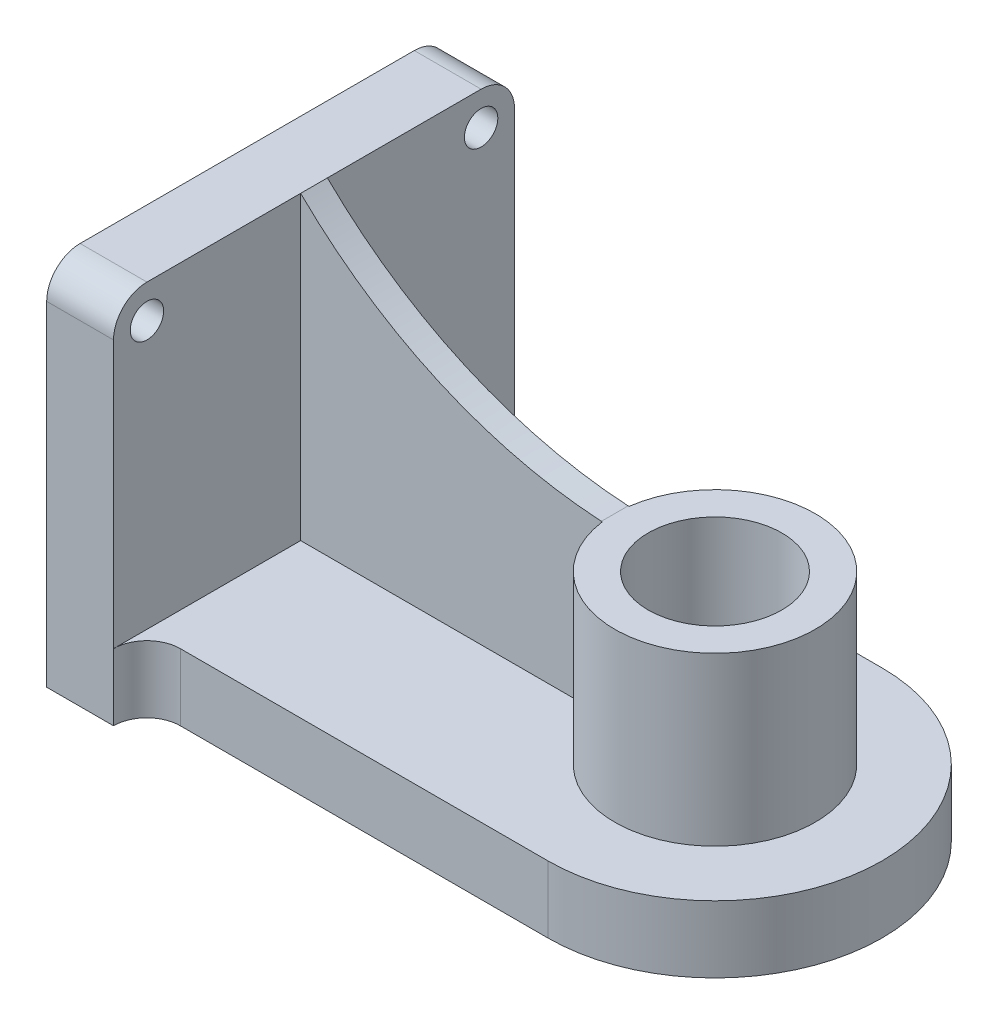
ISO-10303-21;
HEADER;
FILE_DESCRIPTION(('STEP AP214'),'2;1');
FILE_NAME('part.step','',(''),(''),'','','');
FILE_SCHEMA(('AUTOMOTIVE_DESIGN { 1 0 10303 214 1 1 1 1 }'));
ENDSEC;
DATA;
#1=APPLICATION_CONTEXT('core data for automotive mechanical design processes');
#2=APPLICATION_PROTOCOL_DEFINITION('international standard','automotive_design',2000,#1);
#3=PRODUCT_CONTEXT('',#1,'mechanical');
#4=PRODUCT('Part','Part','',(#3));
#5=PRODUCT_RELATED_PRODUCT_CATEGORY('part','',(#4));
#6=PRODUCT_DEFINITION_FORMATION('','',#4);
#7=PRODUCT_DEFINITION_CONTEXT('part definition',#1,'design');
#8=PRODUCT_DEFINITION('design','',#6,#7);
#9=PRODUCT_DEFINITION_SHAPE('','',#8);
#10=(LENGTH_UNIT() NAMED_UNIT(*) SI_UNIT(.MILLI.,.METRE.));
#11=(NAMED_UNIT(*) PLANE_ANGLE_UNIT() SI_UNIT($,.RADIAN.));
#12=(NAMED_UNIT(*) SI_UNIT($,.STERADIAN.) SOLID_ANGLE_UNIT());
#13=UNCERTAINTY_MEASURE_WITH_UNIT(LENGTH_MEASURE(1.E-05),#10,'distance_accuracy_value','');
#14=(GEOMETRIC_REPRESENTATION_CONTEXT(3) GLOBAL_UNCERTAINTY_ASSIGNED_CONTEXT((#13)) GLOBAL_UNIT_ASSIGNED_CONTEXT((#10,
#11,#12)) REPRESENTATION_CONTEXT('',''));
#15=CARTESIAN_POINT('',(0.,0.,0.));
#16=DIRECTION('',(0.,0.,1.));
#17=DIRECTION('',(1.,0.,0.));
#18=AXIS2_PLACEMENT_3D('',#15,#16,#17);
#19=CARTESIAN_POINT('',(5.,27.5,30.));
#20=DIRECTION('',(-1.,0.,0.));
#21=DIRECTION('',(0.,-1.,0.));
#22=AXIS2_PLACEMENT_3D('',#19,#20,#21);
#23=PLANE('',#22);
#24=CARTESIAN_POINT('',(5.,22.5,-25.));
#25=DIRECTION('',(1.,0.,0.));
#26=DIRECTION('',(0.,0.,-1.));
#27=AXIS2_PLACEMENT_3D('',#24,#25,#26);
#28=CIRCLE('',#27,2.50000000000001);
#29=CARTESIAN_POINT('',(5.,22.5,-27.5));
#30=VERTEX_POINT('',#29);
#31=EDGE_CURVE('E225',#30,#30,#28,.T.);
#32=ORIENTED_EDGE('',*,*,#31,.F.);
#33=EDGE_LOOP('',(#32));
#34=FACE_BOUND('',#33,.T.);
#35=DIRECTION('',(0.,1.,0.));
#36=VECTOR('',#35,1.);
#37=CARTESIAN_POINT('',(5.,27.5,-2.));
#38=LINE('',#37,#36);
#39=CARTESIAN_POINT('',(5.,-17.5,-2.));
#40=VERTEX_POINT('',#39);
#41=CARTESIAN_POINT('',(5.,27.5,-2.));
#42=VERTEX_POINT('',#41);
#43=EDGE_CURVE('E209',#40,#42,#38,.T.);
#44=ORIENTED_EDGE('',*,*,#43,.F.);
#45=DIRECTION('',(0.,0.,-1.));
#46=VECTOR('',#45,1.);
#47=CARTESIAN_POINT('',(5.,-17.5,30.));
#48=LINE('',#47,#46);
#49=CARTESIAN_POINT('',(5.,-17.5,-30.));
#50=VERTEX_POINT('',#49);
#51=EDGE_CURVE('E311',#40,#50,#48,.T.);
#52=ORIENTED_EDGE('',*,*,#51,.T.);
#53=DIRECTION('',(0.,1.,0.));
#54=VECTOR('',#53,1.);
#55=CARTESIAN_POINT('',(5.,27.5,-30.));
#56=LINE('',#55,#54);
#57=CARTESIAN_POINT('',(5.,22.5,-30.));
#58=VERTEX_POINT('',#57);
#59=EDGE_CURVE('E277',#50,#58,#56,.T.);
#60=ORIENTED_EDGE('',*,*,#59,.T.);
#61=CARTESIAN_POINT('',(5.,22.5,-25.));
#62=DIRECTION('',(-1.,0.,0.));
#63=DIRECTION('',(0.,-1.,0.));
#64=AXIS2_PLACEMENT_3D('',#61,#62,#63);
#65=CIRCLE('',#64,5.);
#66=CARTESIAN_POINT('',(5.,27.5,-25.));
#67=VERTEX_POINT('',#66);
#68=EDGE_CURVE('E56',#58,#67,#65,.F.);
#69=ORIENTED_EDGE('',*,*,#68,.T.);
#70=DIRECTION('',(0.,0.,-1.));
#71=VECTOR('',#70,1.);
#72=CARTESIAN_POINT('',(5.,27.5,30.));
#73=LINE('',#72,#71);
#74=EDGE_CURVE('E63',#42,#67,#73,.T.);
#75=ORIENTED_EDGE('',*,*,#74,.F.);
#76=EDGE_LOOP('',(#44,#52,#60,#69,#75));
#77=FACE_BOUND('',#76,.T.);
#78=ADVANCED_FACE('F47',(#34,#77),#23,.F.);
#79=CARTESIAN_POINT('',(5.,-17.5,30.));
#80=VERTEX_POINT('',#79);
#81=CARTESIAN_POINT('',(5.,-17.5,2.));
#82=VERTEX_POINT('',#81);
#83=EDGE_CURVE('E312',#80,#82,#48,.T.);
#84=ORIENTED_EDGE('',*,*,#83,.T.);
#85=DIRECTION('',(0.,1.,0.));
#86=VECTOR('',#85,1.);
#87=CARTESIAN_POINT('',(5.,27.5,2.));
#88=LINE('',#87,#86);
#89=CARTESIAN_POINT('',(5.,27.5,2.));
#90=VERTEX_POINT('',#89);
#91=EDGE_CURVE('E71',#82,#90,#88,.T.);
#92=ORIENTED_EDGE('',*,*,#91,.T.);
#93=CARTESIAN_POINT('',(5.,27.5,25.));
#94=VERTEX_POINT('',#93);
#95=EDGE_CURVE('E308',#94,#90,#73,.T.);
#96=ORIENTED_EDGE('',*,*,#95,.F.);
#97=CARTESIAN_POINT('',(5.,22.5,25.));
#98=DIRECTION('',(-1.,0.,0.));
#99=DIRECTION('',(0.,-1.,0.));
#100=AXIS2_PLACEMENT_3D('',#97,#98,#99);
#101=CIRCLE('',#100,5.);
#102=CARTESIAN_POINT('',(5.,22.5,30.));
#103=VERTEX_POINT('',#102);
#104=EDGE_CURVE('E352',#94,#103,#101,.F.);
#105=ORIENTED_EDGE('',*,*,#104,.T.);
#106=DIRECTION('',(0.,1.,0.));
#107=VECTOR('',#106,1.);
#108=CARTESIAN_POINT('',(5.,27.5,30.));
#109=LINE('',#108,#107);
#110=EDGE_CURVE('E283',#80,#103,#109,.T.);
#111=ORIENTED_EDGE('',*,*,#110,.F.);
#112=EDGE_LOOP('',(#84,#92,#96,#105,#111));
#113=FACE_BOUND('',#112,.T.);
#114=CARTESIAN_POINT('',(5.,22.5,25.));
#115=DIRECTION('',(1.,0.,0.));
#116=DIRECTION('',(0.,0.,-1.));
#117=AXIS2_PLACEMENT_3D('',#114,#115,#116);
#118=CIRCLE('',#117,2.50000000000001);
#119=CARTESIAN_POINT('',(5.,22.5,22.5));
#120=VERTEX_POINT('',#119);
#121=EDGE_CURVE('E217',#120,#120,#118,.T.);
#122=ORIENTED_EDGE('',*,*,#121,.F.);
#123=EDGE_LOOP('',(#122));
#124=FACE_BOUND('',#123,.T.);
#125=ADVANCED_FACE('F415',(#113,#124),#23,.F.);
#126=CARTESIAN_POINT('',(-5.,27.5,30.));
#127=DIRECTION('',(0.,-1.,0.));
#128=DIRECTION('',(0.,0.,-1.));
#129=AXIS2_PLACEMENT_3D('',#126,#127,#128);
#130=PLANE('',#129);
#131=ORIENTED_EDGE('',*,*,#95,.T.);
#132=DIRECTION('',(0.,0.,-1.));
#133=VECTOR('',#132,1.);
#134=CARTESIAN_POINT('',(4.99999999999998,27.5,2.));
#135=LINE('',#134,#133);
#136=EDGE_CURVE('E188',#90,#42,#135,.T.);
#137=ORIENTED_EDGE('',*,*,#136,.T.);
#138=ORIENTED_EDGE('',*,*,#74,.T.);
#139=DIRECTION('',(-1.,0.,0.));
#140=VECTOR('',#139,1.);
#141=CARTESIAN_POINT('',(-5.,27.5,-25.));
#142=LINE('',#141,#140);
#143=CARTESIAN_POINT('',(-5.,27.5,-25.));
#144=VERTEX_POINT('',#143);
#145=EDGE_CURVE('E339',#67,#144,#142,.T.);
#146=ORIENTED_EDGE('',*,*,#145,.T.);
#147=DIRECTION('',(0.,0.,-1.));
#148=VECTOR('',#147,1.);
#149=CARTESIAN_POINT('',(-5.,27.5,30.));
#150=LINE('',#149,#148);
#151=CARTESIAN_POINT('',(-5.,27.5,25.));
#152=VERTEX_POINT('',#151);
#153=EDGE_CURVE('E304',#152,#144,#150,.T.);
#154=ORIENTED_EDGE('',*,*,#153,.F.);
#155=DIRECTION('',(-1.,0.,0.));
#156=VECTOR('',#155,1.);
#157=CARTESIAN_POINT('',(5.,27.5,25.));
#158=LINE('',#157,#156);
#159=EDGE_CURVE('E336',#152,#94,#158,.F.);
#160=ORIENTED_EDGE('',*,*,#159,.T.);
#161=EDGE_LOOP('',(#131,#137,#138,#146,#154,#160));
#162=FACE_BOUND('',#161,.T.);
#163=ADVANCED_FACE('F364',(#162),#130,.F.);
#164=CARTESIAN_POINT('',(-5.,27.5,30.));
#165=DIRECTION('',(1.,0.,0.));
#166=DIRECTION('',(0.,1.,0.));
#167=AXIS2_PLACEMENT_3D('',#164,#165,#166);
#168=PLANE('',#167);
#169=CARTESIAN_POINT('',(-5.,22.5,25.));
#170=DIRECTION('',(1.,0.,0.));
#171=DIRECTION('',(0.,1.,0.));
#172=AXIS2_PLACEMENT_3D('',#169,#170,#171);
#173=CIRCLE('',#172,2.50000000000001);
#174=CARTESIAN_POINT('',(-5.,25.,25.));
#175=VERTEX_POINT('',#174);
#176=EDGE_CURVE('E221',#175,#175,#173,.T.);
#177=ORIENTED_EDGE('',*,*,#176,.T.);
#178=EDGE_LOOP('',(#177));
#179=FACE_BOUND('',#178,.T.);
#180=CARTESIAN_POINT('',(-5.,22.5,-25.));
#181=DIRECTION('',(1.,0.,0.));
#182=DIRECTION('',(0.,1.,0.));
#183=AXIS2_PLACEMENT_3D('',#180,#181,#182);
#184=CIRCLE('',#183,2.50000000000001);
#185=CARTESIAN_POINT('',(-5.,25.,-25.));
#186=VERTEX_POINT('',#185);
#187=EDGE_CURVE('E229',#186,#186,#184,.T.);
#188=ORIENTED_EDGE('',*,*,#187,.T.);
#189=EDGE_LOOP('',(#188));
#190=FACE_BOUND('',#189,.T.);
#191=ORIENTED_EDGE('',*,*,#153,.T.);
#192=CARTESIAN_POINT('',(-5.,22.5,-25.));
#193=DIRECTION('',(1.,0.,0.));
#194=DIRECTION('',(0.,1.,0.));
#195=AXIS2_PLACEMENT_3D('',#192,#193,#194);
#196=CIRCLE('',#195,5.);
#197=CARTESIAN_POINT('',(-5.,22.5,-30.));
#198=VERTEX_POINT('',#197);
#199=EDGE_CURVE('E346',#144,#198,#196,.F.);
#200=ORIENTED_EDGE('',*,*,#199,.T.);
#201=DIRECTION('',(0.,-1.,0.));
#202=VECTOR('',#201,1.);
#203=CARTESIAN_POINT('',(-5.,27.5,-30.));
#204=LINE('',#203,#202);
#205=CARTESIAN_POINT('',(-5.,-27.5,-30.));
#206=VERTEX_POINT('',#205);
#207=EDGE_CURVE('E295',#198,#206,#204,.T.);
#208=ORIENTED_EDGE('',*,*,#207,.T.);
#209=DIRECTION('',(0.,0.,-1.));
#210=VECTOR('',#209,1.);
#211=CARTESIAN_POINT('',(-5.,-27.5,30.));
#212=LINE('',#211,#210);
#213=CARTESIAN_POINT('',(-5.,-27.5,30.));
#214=VERTEX_POINT('',#213);
#215=EDGE_CURVE('E290',#214,#206,#212,.T.);
#216=ORIENTED_EDGE('',*,*,#215,.F.);
#217=DIRECTION('',(0.,-1.,0.));
#218=VECTOR('',#217,1.);
#219=CARTESIAN_POINT('',(-5.,27.5,30.));
#220=LINE('',#219,#218);
#221=CARTESIAN_POINT('',(-5.,22.5,30.));
#222=VERTEX_POINT('',#221);
#223=EDGE_CURVE('E282',#222,#214,#220,.T.);
#224=ORIENTED_EDGE('',*,*,#223,.F.);
#225=CARTESIAN_POINT('',(-5.,22.5,25.));
#226=DIRECTION('',(1.,0.,0.));
#227=DIRECTION('',(0.,1.,0.));
#228=AXIS2_PLACEMENT_3D('',#225,#226,#227);
#229=CIRCLE('',#228,5.);
#230=EDGE_CURVE('E343',#222,#152,#229,.F.);
#231=ORIENTED_EDGE('',*,*,#230,.T.);
#232=EDGE_LOOP('',(#191,#200,#208,#216,#224,#231));
#233=FACE_BOUND('',#232,.T.);
#234=ADVANCED_FACE('F367',(#179,#190,#233),#168,.F.);
#235=CARTESIAN_POINT('',(-5.,-27.5,30.));
#236=DIRECTION('',(0.,1.,0.));
#237=DIRECTION('',(0.,0.,1.));
#238=AXIS2_PLACEMENT_3D('',#235,#236,#237);
#239=PLANE('',#238);
#240=CARTESIAN_POINT('',(65.,-27.5,0.));
#241=DIRECTION('',(0.,1.,0.));
#242=DIRECTION('',(0.,0.,1.));
#243=AXIS2_PLACEMENT_3D('',#240,#241,#242);
#244=CIRCLE('',#243,10.);
#245=CARTESIAN_POINT('',(65.,-27.5,10.));
#246=VERTEX_POINT('',#245);
#247=EDGE_CURVE('E237',#246,#246,#244,.T.);
#248=ORIENTED_EDGE('',*,*,#247,.T.);
#249=EDGE_LOOP('',(#248));
#250=FACE_BOUND('',#249,.T.);
#251=DIRECTION('',(1.,0.,0.));
#252=VECTOR('',#251,1.);
#253=CARTESIAN_POINT('',(-5.,-27.5,-30.));
#254=LINE('',#253,#252);
#255=CARTESIAN_POINT('',(5.,-27.5,-30.));
#256=VERTEX_POINT('',#255);
#257=EDGE_CURVE('E298',#206,#256,#254,.T.);
#258=ORIENTED_EDGE('',*,*,#257,.T.);
#259=CARTESIAN_POINT('',(10.,-27.5,-30.));
#260=DIRECTION('',(0.,1.,0.));
#261=DIRECTION('',(0.,0.,1.));
#262=AXIS2_PLACEMENT_3D('',#259,#260,#261);
#263=CIRCLE('',#262,5.);
#264=CARTESIAN_POINT('',(10.,-27.5,-25.));
#265=VERTEX_POINT('',#264);
#266=EDGE_CURVE('E333',#256,#265,#263,.T.);
#267=ORIENTED_EDGE('',*,*,#266,.T.);
#268=DIRECTION('',(-1.,0.,0.));
#269=VECTOR('',#268,1.);
#270=CARTESIAN_POINT('',(65.,-27.5,-25.));
#271=LINE('',#270,#269);
#272=CARTESIAN_POINT('',(65.,-27.5,-25.));
#273=VERTEX_POINT('',#272);
#274=EDGE_CURVE('E264',#273,#265,#271,.T.);
#275=ORIENTED_EDGE('',*,*,#274,.F.);
#276=CARTESIAN_POINT('',(65.,-27.5,0.));
#277=DIRECTION('',(0.,1.,0.));
#278=DIRECTION('',(0.,0.,1.));
#279=AXIS2_PLACEMENT_3D('',#276,#277,#278);
#280=CIRCLE('',#279,25.);
#281=CARTESIAN_POINT('',(65.,-27.5,25.));
#282=VERTEX_POINT('',#281);
#283=EDGE_CURVE('E245',#282,#273,#280,.T.);
#284=ORIENTED_EDGE('',*,*,#283,.F.);
#285=DIRECTION('',(1.,0.,0.));
#286=VECTOR('',#285,1.);
#287=CARTESIAN_POINT('',(3.,-27.5,25.));
#288=LINE('',#287,#286);
#289=CARTESIAN_POINT('',(10.,-27.5,25.));
#290=VERTEX_POINT('',#289);
#291=EDGE_CURVE('E253',#290,#282,#288,.T.);
#292=ORIENTED_EDGE('',*,*,#291,.F.);
#293=CARTESIAN_POINT('',(10.,-27.5,30.));
#294=DIRECTION('',(0.,1.,0.));
#295=DIRECTION('',(0.,0.,1.));
#296=AXIS2_PLACEMENT_3D('',#293,#294,#295);
#297=CIRCLE('',#296,5.);
#298=CARTESIAN_POINT('',(5.,-27.5,30.));
#299=VERTEX_POINT('',#298);
#300=EDGE_CURVE('E319',#290,#299,#297,.T.);
#301=ORIENTED_EDGE('',*,*,#300,.T.);
#302=DIRECTION('',(1.,0.,0.));
#303=VECTOR('',#302,1.);
#304=CARTESIAN_POINT('',(-5.,-27.5,30.));
#305=LINE('',#304,#303);
#306=EDGE_CURVE('E286',#214,#299,#305,.T.);
#307=ORIENTED_EDGE('',*,*,#306,.F.);
#308=ORIENTED_EDGE('',*,*,#215,.T.);
#309=EDGE_LOOP('',(#258,#267,#275,#284,#292,#301,#307,#308));
#310=FACE_BOUND('',#309,.T.);
#311=ADVANCED_FACE('F397',(#250,#310),#239,.F.);
#312=CARTESIAN_POINT('',(0.,0.,30.));
#313=DIRECTION('',(0.,0.,1.));
#314=DIRECTION('',(1.,0.,0.));
#315=AXIS2_PLACEMENT_3D('',#312,#313,#314);
#316=PLANE('',#315);
#317=ORIENTED_EDGE('',*,*,#110,.T.);
#318=DIRECTION('',(-1.,0.,0.));
#319=VECTOR('',#318,1.);
#320=CARTESIAN_POINT('',(-5.,22.5,30.));
#321=LINE('',#320,#319);
#322=EDGE_CURVE('E11',#103,#222,#321,.T.);
#323=ORIENTED_EDGE('',*,*,#322,.T.);
#324=ORIENTED_EDGE('',*,*,#223,.T.);
#325=ORIENTED_EDGE('',*,*,#306,.T.);
#326=EDGE_CURVE('E278',#299,#80,#109,.T.);
#327=ORIENTED_EDGE('',*,*,#326,.T.);
#328=EDGE_LOOP('',(#317,#323,#324,#325,#327));
#329=FACE_BOUND('',#328,.T.);
#330=ADVANCED_FACE('F376',(#329),#316,.T.);
#331=CARTESIAN_POINT('',(0.,0.,-30.));
#332=DIRECTION('',(0.,0.,1.));
#333=DIRECTION('',(1.,0.,0.));
#334=AXIS2_PLACEMENT_3D('',#331,#332,#333);
#335=PLANE('',#334);
#336=ORIENTED_EDGE('',*,*,#207,.F.);
#337=DIRECTION('',(-1.,0.,0.));
#338=VECTOR('',#337,1.);
#339=CARTESIAN_POINT('',(0.,22.5,-30.));
#340=LINE('',#339,#338);
#341=EDGE_CURVE('E349',#198,#58,#340,.F.);
#342=ORIENTED_EDGE('',*,*,#341,.T.);
#343=ORIENTED_EDGE('',*,*,#59,.F.);
#344=EDGE_CURVE('E291',#256,#50,#56,.T.);
#345=ORIENTED_EDGE('',*,*,#344,.F.);
#346=ORIENTED_EDGE('',*,*,#257,.F.);
#347=EDGE_LOOP('',(#336,#342,#343,#345,#346));
#348=FACE_BOUND('',#347,.T.);
#349=ADVANCED_FACE('F392',(#348),#335,.F.);
#350=CARTESIAN_POINT('',(65.,-17.5,0.));
#351=DIRECTION('',(0.,1.,0.));
#352=DIRECTION('',(0.,0.,1.));
#353=AXIS2_PLACEMENT_3D('',#350,#351,#352);
#354=PLANE('',#353);
#355=DIRECTION('',(1.,0.,0.));
#356=VECTOR('',#355,1.);
#357=CARTESIAN_POINT('',(10.,-17.5,2.));
#358=LINE('',#357,#356);
#359=CARTESIAN_POINT('',(50.1339312526815,-17.5,2.));
#360=VERTEX_POINT('',#359);
#361=EDGE_CURVE('E175',#82,#360,#358,.T.);
#362=ORIENTED_EDGE('',*,*,#361,.F.);
#363=ORIENTED_EDGE('',*,*,#83,.F.);
#364=CARTESIAN_POINT('',(10.,-17.5,30.));
#365=DIRECTION('',(0.,1.,0.));
#366=DIRECTION('',(0.,0.,1.));
#367=AXIS2_PLACEMENT_3D('',#364,#365,#366);
#368=CIRCLE('',#367,5.);
#369=CARTESIAN_POINT('',(10.,-17.5,25.));
#370=VERTEX_POINT('',#369);
#371=EDGE_CURVE('E322',#80,#370,#368,.F.);
#372=ORIENTED_EDGE('',*,*,#371,.T.);
#373=DIRECTION('',(1.,0.,0.));
#374=VECTOR('',#373,1.);
#375=CARTESIAN_POINT('',(3.,-17.5,25.));
#376=LINE('',#375,#374);
#377=CARTESIAN_POINT('',(65.,-17.5,25.));
#378=VERTEX_POINT('',#377);
#379=EDGE_CURVE('E257',#370,#378,#376,.T.);
#380=ORIENTED_EDGE('',*,*,#379,.T.);
#381=CARTESIAN_POINT('',(65.,-17.5,0.));
#382=DIRECTION('',(0.,1.,0.));
#383=DIRECTION('',(0.,0.,1.));
#384=AXIS2_PLACEMENT_3D('',#381,#382,#383);
#385=CIRCLE('',#384,25.);
#386=CARTESIAN_POINT('',(65.,-17.5,-25.));
#387=VERTEX_POINT('',#386);
#388=EDGE_CURVE('E248',#378,#387,#385,.T.);
#389=ORIENTED_EDGE('',*,*,#388,.T.);
#390=DIRECTION('',(-1.,0.,0.));
#391=VECTOR('',#390,1.);
#392=CARTESIAN_POINT('',(65.,-17.5,-25.));
#393=LINE('',#392,#391);
#394=CARTESIAN_POINT('',(10.,-17.5,-25.));
#395=VERTEX_POINT('',#394);
#396=EDGE_CURVE('E252',#387,#395,#393,.T.);
#397=ORIENTED_EDGE('',*,*,#396,.T.);
#398=CARTESIAN_POINT('',(10.,-17.5,-30.));
#399=DIRECTION('',(0.,1.,0.));
#400=DIRECTION('',(0.,0.,1.));
#401=AXIS2_PLACEMENT_3D('',#398,#399,#400);
#402=CIRCLE('',#401,5.);
#403=EDGE_CURVE('E329',#395,#50,#402,.F.);
#404=ORIENTED_EDGE('',*,*,#403,.T.);
#405=ORIENTED_EDGE('',*,*,#51,.F.);
#406=DIRECTION('',(1.,0.,0.));
#407=VECTOR('',#406,1.);
#408=CARTESIAN_POINT('',(10.,-17.5,-2.));
#409=LINE('',#408,#407);
#410=CARTESIAN_POINT('',(50.1339312526815,-17.5,-2.));
#411=VERTEX_POINT('',#410);
#412=EDGE_CURVE('E202',#40,#411,#409,.T.);
#413=ORIENTED_EDGE('',*,*,#412,.T.);
#414=CARTESIAN_POINT('',(65.,-17.5,0.));
#415=DIRECTION('',(0.,1.,0.));
#416=DIRECTION('',(0.,0.,1.));
#417=AXIS2_PLACEMENT_3D('',#414,#415,#416);
#418=CIRCLE('',#417,15.);
#419=EDGE_CURVE('E241',#360,#411,#418,.T.);
#420=ORIENTED_EDGE('',*,*,#419,.F.);
#421=EDGE_LOOP('',(#362,#363,#372,#380,#389,#397,#404,#405,#413,#420));
#422=FACE_BOUND('',#421,.T.);
#423=ADVANCED_FACE('F387',(#422),#354,.T.);
#424=CARTESIAN_POINT('',(65.,-17.5,-25.));
#425=DIRECTION('',(0.,0.,1.));
#426=DIRECTION('',(1.,0.,0.));
#427=AXIS2_PLACEMENT_3D('',#424,#425,#426);
#428=PLANE('',#427);
#429=ORIENTED_EDGE('',*,*,#274,.T.);
#430=DIRECTION('',(0.,1.,0.));
#431=VECTOR('',#430,1.);
#432=CARTESIAN_POINT('',(10.,-17.5,-25.));
#433=LINE('',#432,#431);
#434=EDGE_CURVE('E325',#265,#395,#433,.T.);
#435=ORIENTED_EDGE('',*,*,#434,.T.);
#436=ORIENTED_EDGE('',*,*,#396,.F.);
#437=DIRECTION('',(0.,-1.,0.));
#438=VECTOR('',#437,1.);
#439=CARTESIAN_POINT('',(65.,-17.5,-25.));
#440=LINE('',#439,#438);
#441=EDGE_CURVE('E273',#387,#273,#440,.T.);
#442=ORIENTED_EDGE('',*,*,#441,.T.);
#443=EDGE_LOOP('',(#429,#435,#436,#442));
#444=FACE_BOUND('',#443,.T.);
#445=ADVANCED_FACE('F400',(#444),#428,.F.);
#446=CARTESIAN_POINT('',(3.,-17.5,25.));
#447=DIRECTION('',(0.,0.,-1.));
#448=DIRECTION('',(-1.,0.,0.));
#449=AXIS2_PLACEMENT_3D('',#446,#447,#448);
#450=PLANE('',#449);
#451=ORIENTED_EDGE('',*,*,#379,.F.);
#452=DIRECTION('',(0.,-1.,0.));
#453=VECTOR('',#452,1.);
#454=CARTESIAN_POINT('',(10.,-27.5,25.));
#455=LINE('',#454,#453);
#456=EDGE_CURVE('E315',#370,#290,#455,.T.);
#457=ORIENTED_EDGE('',*,*,#456,.T.);
#458=ORIENTED_EDGE('',*,*,#291,.T.);
#459=DIRECTION('',(0.,-1.,0.));
#460=VECTOR('',#459,1.);
#461=CARTESIAN_POINT('',(65.,-17.5,25.));
#462=LINE('',#461,#460);
#463=EDGE_CURVE('E260',#378,#282,#462,.T.);
#464=ORIENTED_EDGE('',*,*,#463,.F.);
#465=EDGE_LOOP('',(#451,#457,#458,#464));
#466=FACE_BOUND('',#465,.T.);
#467=ADVANCED_FACE('F410',(#466),#450,.F.);
#468=CARTESIAN_POINT('',(65.,-17.5,0.));
#469=DIRECTION('',(0.,-1.,0.));
#470=DIRECTION('',(0.,0.,-1.));
#471=AXIS2_PLACEMENT_3D('',#468,#469,#470);
#472=CYLINDRICAL_SURFACE('',#471,25.);
#473=ORIENTED_EDGE('',*,*,#283,.T.);
#474=ORIENTED_EDGE('',*,*,#441,.F.);
#475=ORIENTED_EDGE('',*,*,#388,.F.);
#476=ORIENTED_EDGE('',*,*,#463,.T.);
#477=EDGE_LOOP('',(#473,#474,#475,#476));
#478=FACE_BOUND('',#477,.T.);
#479=ADVANCED_FACE('F404',(#478),#472,.T.);
#480=CARTESIAN_POINT('',(10.,-17.5,30.));
#481=DIRECTION('',(0.,1.,0.));
#482=DIRECTION('',(-1.,0.,0.));
#483=AXIS2_PLACEMENT_3D('',#480,#481,#482);
#484=CYLINDRICAL_SURFACE('',#483,5.);
#485=ORIENTED_EDGE('',*,*,#371,.F.);
#486=ORIENTED_EDGE('',*,*,#326,.F.);
#487=ORIENTED_EDGE('',*,*,#300,.F.);
#488=ORIENTED_EDGE('',*,*,#456,.F.);
#489=EDGE_LOOP('',(#485,#486,#487,#488));
#490=FACE_BOUND('',#489,.T.);
#491=ADVANCED_FACE('F413',(#490),#484,.F.);
#492=CARTESIAN_POINT('',(10.,-17.5,-30.));
#493=DIRECTION('',(0.,-1.,0.));
#494=DIRECTION('',(1.,0.,0.));
#495=AXIS2_PLACEMENT_3D('',#492,#493,#494);
#496=CYLINDRICAL_SURFACE('',#495,5.);
#497=ORIENTED_EDGE('',*,*,#266,.F.);
#498=ORIENTED_EDGE('',*,*,#344,.T.);
#499=ORIENTED_EDGE('',*,*,#403,.F.);
#500=ORIENTED_EDGE('',*,*,#434,.F.);
#501=EDGE_LOOP('',(#497,#498,#499,#500));
#502=FACE_BOUND('',#501,.T.);
#503=ADVANCED_FACE('F395',(#502),#496,.F.);
#504=CARTESIAN_POINT('',(65.,7.5,0.));
#505=DIRECTION('',(0.,-1.,0.));
#506=DIRECTION('',(0.,0.,-1.));
#507=AXIS2_PLACEMENT_3D('',#504,#505,#506);
#508=CYLINDRICAL_SURFACE('',#507,15.);
#509=CARTESIAN_POINT('',(65.,7.5,0.));
#510=DIRECTION('',(0.,1.,0.));
#511=DIRECTION('',(0.,0.,1.));
#512=AXIS2_PLACEMENT_3D('',#509,#510,#511);
#513=CIRCLE('',#512,15.);
#514=CARTESIAN_POINT('',(50.1339312526815,7.5,2.));
#515=VERTEX_POINT('',#514);
#516=CARTESIAN_POINT('',(50.1339312526815,7.5,-2.));
#517=VERTEX_POINT('',#516);
#518=EDGE_CURVE('E242',#515,#517,#513,.T.);
#519=ORIENTED_EDGE('',*,*,#518,.F.);
#520=DIRECTION('',(0.,-1.,0.));
#521=VECTOR('',#520,1.);
#522=CARTESIAN_POINT('',(50.1339312526815,7.5,2.));
#523=LINE('',#522,#521);
#524=EDGE_CURVE('E171',#515,#360,#523,.T.);
#525=ORIENTED_EDGE('',*,*,#524,.T.);
#526=ORIENTED_EDGE('',*,*,#419,.T.);
#527=DIRECTION('',(0.,-1.,0.));
#528=VECTOR('',#527,1.);
#529=CARTESIAN_POINT('',(50.1339312526815,7.5,-2.));
#530=LINE('',#529,#528);
#531=EDGE_CURVE('E187',#517,#411,#530,.T.);
#532=ORIENTED_EDGE('',*,*,#531,.F.);
#533=EDGE_LOOP('',(#519,#525,#526,#532));
#534=FACE_BOUND('',#533,.T.);
#535=ADVANCED_FACE('F448',(#534),#508,.T.);
#536=CARTESIAN_POINT('',(65.,7.5,0.));
#537=DIRECTION('',(0.,1.,0.));
#538=DIRECTION('',(0.,0.,1.));
#539=AXIS2_PLACEMENT_3D('',#536,#537,#538);
#540=PLANE('',#539);
#541=DIRECTION('',(-1.,0.,0.));
#542=VECTOR('',#541,1.);
#543=CARTESIAN_POINT('',(50.,7.5,-2.));
#544=LINE('',#543,#542);
#545=CARTESIAN_POINT('',(50.,7.5,-2.));
#546=VERTEX_POINT('',#545);
#547=EDGE_CURVE('E182',#517,#546,#544,.T.);
#548=ORIENTED_EDGE('',*,*,#547,.T.);
#549=DIRECTION('',(0.,0.,-1.));
#550=VECTOR('',#549,1.);
#551=CARTESIAN_POINT('',(50.,7.5,2.));
#552=LINE('',#551,#550);
#553=CARTESIAN_POINT('',(50.,7.5,2.));
#554=VERTEX_POINT('',#553);
#555=EDGE_CURVE('E178',#554,#546,#552,.T.);
#556=ORIENTED_EDGE('',*,*,#555,.F.);
#557=DIRECTION('',(-1.,0.,0.));
#558=VECTOR('',#557,1.);
#559=CARTESIAN_POINT('',(50.,7.5,2.));
#560=LINE('',#559,#558);
#561=EDGE_CURVE('E164',#515,#554,#560,.T.);
#562=ORIENTED_EDGE('',*,*,#561,.F.);
#563=ORIENTED_EDGE('',*,*,#518,.T.);
#564=EDGE_LOOP('',(#548,#556,#562,#563));
#565=FACE_BOUND('',#564,.T.);
#566=CARTESIAN_POINT('',(65.,7.5,0.));
#567=DIRECTION('',(0.,1.,0.));
#568=DIRECTION('',(0.,0.,1.));
#569=AXIS2_PLACEMENT_3D('',#566,#567,#568);
#570=CIRCLE('',#569,10.);
#571=CARTESIAN_POINT('',(65.,7.5,10.));
#572=VERTEX_POINT('',#571);
#573=EDGE_CURVE('E233',#572,#572,#570,.T.);
#574=ORIENTED_EDGE('',*,*,#573,.F.);
#575=EDGE_LOOP('',(#574));
#576=FACE_BOUND('',#575,.T.);
#577=ADVANCED_FACE('F179',(#565,#576),#540,.T.);
#578=CARTESIAN_POINT('',(65.,7.5,0.));
#579=DIRECTION('',(0.,1.,0.));
#580=DIRECTION('',(0.,0.,1.));
#581=AXIS2_PLACEMENT_3D('',#578,#579,#580);
#582=CYLINDRICAL_SURFACE('',#581,10.);
#583=ORIENTED_EDGE('',*,*,#247,.F.);
#584=EDGE_LOOP('',(#583));
#585=FACE_BOUND('',#584,.T.);
#586=ORIENTED_EDGE('',*,*,#573,.T.);
#587=EDGE_LOOP('',(#586));
#588=FACE_BOUND('',#587,.T.);
#589=ADVANCED_FACE('F450',(#585,#588),#582,.F.);
#590=CARTESIAN_POINT('',(-5.,22.5,-25.));
#591=DIRECTION('',(-1.,0.,0.));
#592=DIRECTION('',(0.,0.,1.));
#593=AXIS2_PLACEMENT_3D('',#590,#591,#592);
#594=CYLINDRICAL_SURFACE('',#593,5.);
#595=ORIENTED_EDGE('',*,*,#68,.F.);
#596=ORIENTED_EDGE('',*,*,#341,.F.);
#597=ORIENTED_EDGE('',*,*,#199,.F.);
#598=ORIENTED_EDGE('',*,*,#145,.F.);
#599=EDGE_LOOP('',(#595,#596,#597,#598));
#600=FACE_BOUND('',#599,.T.);
#601=ADVANCED_FACE('F361',(#600),#594,.T.);
#602=CARTESIAN_POINT('',(0.,22.5,25.));
#603=DIRECTION('',(1.,0.,0.));
#604=DIRECTION('',(0.,0.,-1.));
#605=AXIS2_PLACEMENT_3D('',#602,#603,#604);
#606=CYLINDRICAL_SURFACE('',#605,5.);
#607=ORIENTED_EDGE('',*,*,#104,.F.);
#608=ORIENTED_EDGE('',*,*,#159,.F.);
#609=ORIENTED_EDGE('',*,*,#230,.F.);
#610=ORIENTED_EDGE('',*,*,#322,.F.);
#611=EDGE_LOOP('',(#607,#608,#609,#610));
#612=FACE_BOUND('',#611,.T.);
#613=ADVANCED_FACE('F49',(#612),#606,.T.);
#614=CARTESIAN_POINT('',(5.,22.5,-25.));
#615=DIRECTION('',(1.,0.,0.));
#616=DIRECTION('',(0.,0.,-1.));
#617=AXIS2_PLACEMENT_3D('',#614,#615,#616);
#618=CYLINDRICAL_SURFACE('',#617,2.50000000000001);
#619=ORIENTED_EDGE('',*,*,#187,.F.);
#620=EDGE_LOOP('',(#619));
#621=FACE_BOUND('',#620,.T.);
#622=ORIENTED_EDGE('',*,*,#31,.T.);
#623=EDGE_LOOP('',(#622));
#624=FACE_BOUND('',#623,.T.);
#625=ADVANCED_FACE('F424',(#621,#624),#618,.F.);
#626=CARTESIAN_POINT('',(5.,22.5,25.));
#627=DIRECTION('',(1.,0.,0.));
#628=DIRECTION('',(0.,0.,-1.));
#629=AXIS2_PLACEMENT_3D('',#626,#627,#628);
#630=CYLINDRICAL_SURFACE('',#629,2.50000000000001);
#631=ORIENTED_EDGE('',*,*,#176,.F.);
#632=EDGE_LOOP('',(#631));
#633=FACE_BOUND('',#632,.T.);
#634=ORIENTED_EDGE('',*,*,#121,.T.);
#635=EDGE_LOOP('',(#634));
#636=FACE_BOUND('',#635,.T.);
#637=ADVANCED_FACE('F422',(#633,#636),#630,.F.);
#638=CARTESIAN_POINT('',(54.1129183420461,77.3790662696037,2.));
#639=DIRECTION('',(0.,0.,1.));
#640=DIRECTION('',(1.,0.,0.));
#641=AXIS2_PLACEMENT_3D('',#638,#639,#640);
#642=PLANE('',#641);
#643=ORIENTED_EDGE('',*,*,#91,.F.);
#644=ORIENTED_EDGE('',*,*,#361,.T.);
#645=ORIENTED_EDGE('',*,*,#524,.F.);
#646=ORIENTED_EDGE('',*,*,#561,.T.);
#647=CARTESIAN_POINT('',(54.1129183420461,77.3790662696037,2.));
#648=DIRECTION('',(0.,0.,-1.));
#649=DIRECTION('',(1.,0.,0.));
#650=AXIS2_PLACEMENT_3D('',#647,#648,#649);
#651=CIRCLE('',#650,70.);
#652=EDGE_CURVE('E168',#554,#90,#651,.T.);
#653=ORIENTED_EDGE('',*,*,#652,.T.);
#654=EDGE_LOOP('',(#643,#644,#645,#646,#653));
#655=FACE_BOUND('',#654,.T.);
#656=ADVANCED_FACE('F166',(#655),#642,.T.);
#657=CARTESIAN_POINT('',(54.1129183420461,77.3790662696037,-2.));
#658=DIRECTION('',(0.,0.,1.));
#659=DIRECTION('',(1.,0.,0.));
#660=AXIS2_PLACEMENT_3D('',#657,#658,#659);
#661=PLANE('',#660);
#662=ORIENTED_EDGE('',*,*,#412,.F.);
#663=ORIENTED_EDGE('',*,*,#43,.T.);
#664=CARTESIAN_POINT('',(54.1129183420461,77.3790662696037,-2.));
#665=DIRECTION('',(0.,0.,-1.));
#666=DIRECTION('',(1.,0.,0.));
#667=AXIS2_PLACEMENT_3D('',#664,#665,#666);
#668=CIRCLE('',#667,70.);
#669=EDGE_CURVE('E199',#546,#42,#668,.T.);
#670=ORIENTED_EDGE('',*,*,#669,.F.);
#671=ORIENTED_EDGE('',*,*,#547,.F.);
#672=ORIENTED_EDGE('',*,*,#531,.T.);
#673=EDGE_LOOP('',(#662,#663,#670,#671,#672));
#674=FACE_BOUND('',#673,.T.);
#675=ADVANCED_FACE('F432',(#674),#661,.F.);
#676=CARTESIAN_POINT('',(54.1129183420461,77.3790662696037,2.));
#677=DIRECTION('',(0.,0.,-1.));
#678=DIRECTION('',(-1.,0.,0.));
#679=AXIS2_PLACEMENT_3D('',#676,#677,#678);
#680=CYLINDRICAL_SURFACE('',#679,70.);
#681=ORIENTED_EDGE('',*,*,#669,.T.);
#682=ORIENTED_EDGE('',*,*,#136,.F.);
#683=ORIENTED_EDGE('',*,*,#652,.F.);
#684=ORIENTED_EDGE('',*,*,#555,.T.);
#685=EDGE_LOOP('',(#681,#682,#683,#684));
#686=FACE_BOUND('',#685,.T.);
#687=ADVANCED_FACE('F190',(#686),#680,.F.);
#688=CLOSED_SHELL('',(#78,#125,#163,#234,#311,#330,#349,#423,#445,#467,#479,#491,#503,#535,#577,
#589,#601,#613,#625,#637,#656,#675,#687));
#689=MANIFOLD_SOLID_BREP('B2',#688);
#690=ADVANCED_BREP_SHAPE_REPRESENTATION('',(#18,#689),#14);
#691=SHAPE_DEFINITION_REPRESENTATION(#9,#690);
ENDSEC;
END-ISO-10303-21;
